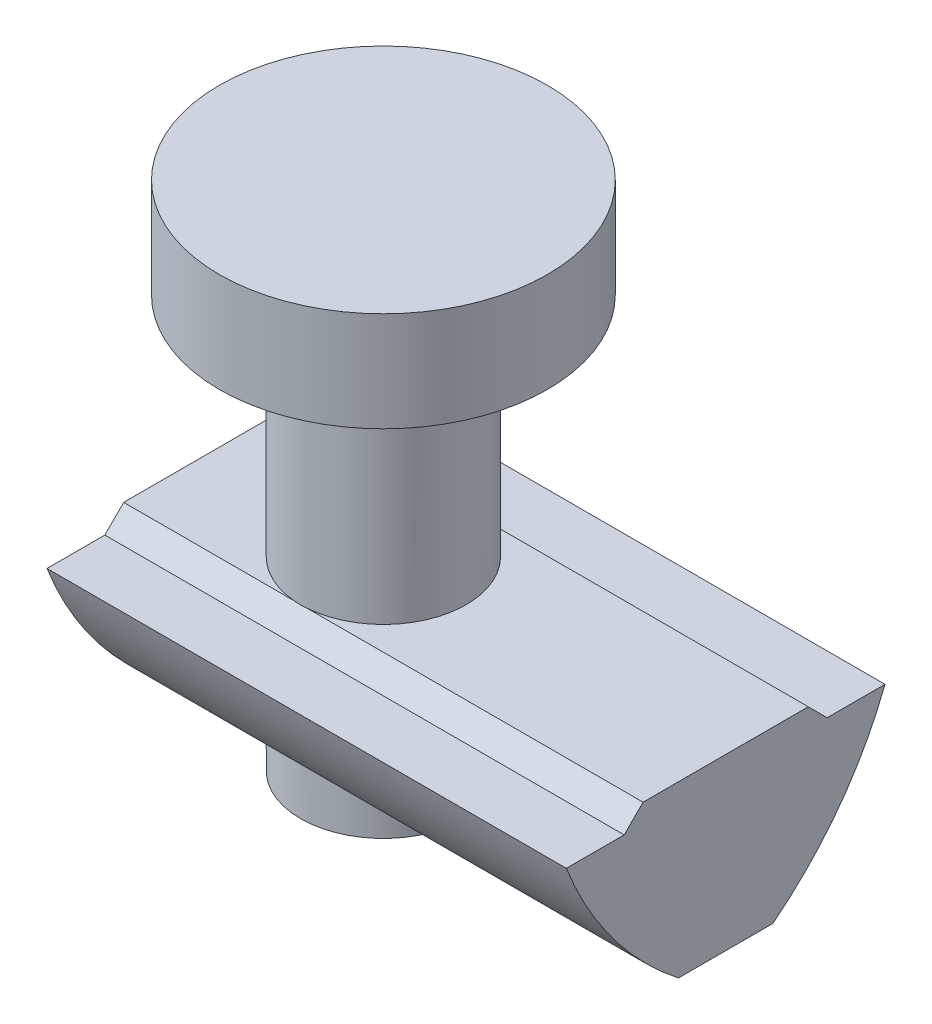
ISO-10303-21;
HEADER;
FILE_DESCRIPTION(('STEP AP214'),'2;1');
FILE_NAME('part.step','',(''),(''),'','','');
FILE_SCHEMA(('AUTOMOTIVE_DESIGN { 1 0 10303 214 1 1 1 1 }'));
ENDSEC;
DATA;
#1=APPLICATION_CONTEXT('core data for automotive mechanical design processes');
#2=APPLICATION_PROTOCOL_DEFINITION('international standard','automotive_design',2000,#1);
#3=PRODUCT_CONTEXT('',#1,'mechanical');
#4=PRODUCT('Part','Part','',(#3));
#5=PRODUCT_RELATED_PRODUCT_CATEGORY('part','',(#4));
#6=PRODUCT_DEFINITION_FORMATION('','',#4);
#7=PRODUCT_DEFINITION_CONTEXT('part definition',#1,'design');
#8=PRODUCT_DEFINITION('design','',#6,#7);
#9=PRODUCT_DEFINITION_SHAPE('','',#8);
#10=(LENGTH_UNIT() NAMED_UNIT(*) SI_UNIT(.MILLI.,.METRE.));
#11=(NAMED_UNIT(*) PLANE_ANGLE_UNIT() SI_UNIT($,.RADIAN.));
#12=(NAMED_UNIT(*) SI_UNIT($,.STERADIAN.) SOLID_ANGLE_UNIT());
#13=UNCERTAINTY_MEASURE_WITH_UNIT(LENGTH_MEASURE(1.E-05),#10,'distance_accuracy_value','');
#14=(GEOMETRIC_REPRESENTATION_CONTEXT(3) GLOBAL_UNCERTAINTY_ASSIGNED_CONTEXT((#13)) GLOBAL_UNIT_ASSIGNED_CONTEXT((#10,
#11,#12)) REPRESENTATION_CONTEXT('',''));
#15=CARTESIAN_POINT('',(0.,0.,0.));
#16=DIRECTION('',(0.,0.,1.));
#17=DIRECTION('',(1.,0.,0.));
#18=AXIS2_PLACEMENT_3D('',#15,#16,#17);
#19=CARTESIAN_POINT('',(0.,-17.46,0.));
#20=DIRECTION('',(0.,1.,0.));
#21=DIRECTION('',(0.,0.,1.));
#22=AXIS2_PLACEMENT_3D('',#19,#20,#21);
#23=CYLINDRICAL_SURFACE('',#22,3.51);
#24=CARTESIAN_POINT('',(0.,-9.60999999999999,0.));
#25=DIRECTION('',(0.,1.,0.));
#26=DIRECTION('',(0.,0.,1.));
#27=AXIS2_PLACEMENT_3D('',#24,#25,#26);
#28=CIRCLE('',#27,3.51);
#29=CARTESIAN_POINT('',(-0.264764045897468,-9.60999999999999,-3.5));
#30=VERTEX_POINT('',#29);
#31=CARTESIAN_POINT('',(-0.264764045897493,-9.60999999999999,3.5));
#32=VERTEX_POINT('',#31);
#33=EDGE_CURVE('E274',#30,#32,#28,.T.);
#34=ORIENTED_EDGE('',*,*,#33,.T.);
#35=CARTESIAN_POINT('',(0.,-6.10999999999996,0.));
#36=DIRECTION('',(0.,0.707106781186544,0.707106781186551));
#37=DIRECTION('',(0.,0.707106781186551,-0.707106781186544));
#38=AXIS2_PLACEMENT_3D('',#35,#36,#37);
#39=ELLIPSE('',#38,4.96388960392959,3.51);
#40=CARTESIAN_POINT('',(0.264764045897493,-9.60999999999999,3.5));
#41=VERTEX_POINT('',#40);
#42=EDGE_CURVE('E11',#32,#41,#39,.T.);
#43=ORIENTED_EDGE('',*,*,#42,.T.);
#44=CARTESIAN_POINT('',(0.264764045897468,-9.60999999999999,-3.5));
#45=VERTEX_POINT('',#44);
#46=EDGE_CURVE('E45',#41,#45,#28,.T.);
#47=ORIENTED_EDGE('',*,*,#46,.T.);
#48=CARTESIAN_POINT('',(0.,-6.10999999999995,0.));
#49=DIRECTION('',(0.,0.707106781186544,-0.707106781186551));
#50=DIRECTION('',(0.,0.707106781186551,0.707106781186544));
#51=AXIS2_PLACEMENT_3D('',#48,#49,#50);
#52=ELLIPSE('',#51,4.96388960392959,3.51);
#53=EDGE_CURVE('E422',#45,#30,#52,.T.);
#54=ORIENTED_EDGE('',*,*,#53,.T.);
#55=EDGE_LOOP('',(#34,#43,#47,#54));
#56=FACE_BOUND('',#55,.T.);
#57=CARTESIAN_POINT('',(0.,0.,0.));
#58=DIRECTION('',(0.,-1.,0.));
#59=DIRECTION('',(0.,0.,-1.));
#60=AXIS2_PLACEMENT_3D('',#57,#58,#59);
#61=CIRCLE('',#60,3.51);
#62=CARTESIAN_POINT('',(0.,0.,-3.51));
#63=VERTEX_POINT('',#62);
#64=EDGE_CURVE('E208',#63,#63,#61,.T.);
#65=ORIENTED_EDGE('',*,*,#64,.T.);
#66=EDGE_LOOP('',(#65));
#67=FACE_BOUND('',#66,.T.);
#68=ADVANCED_FACE('F37',(#56,#67),#23,.T.);
#69=CARTESIAN_POINT('',(0.,4.22,0.));
#70=DIRECTION('',(0.,-1.,0.));
#71=DIRECTION('',(0.,0.,-1.));
#72=AXIS2_PLACEMENT_3D('',#69,#70,#71);
#73=CYLINDRICAL_SURFACE('',#72,6.9469);
#74=CARTESIAN_POINT('',(0.,4.22,0.));
#75=DIRECTION('',(0.,1.,0.));
#76=DIRECTION('',(0.,0.,1.));
#77=AXIS2_PLACEMENT_3D('',#74,#75,#76);
#78=CIRCLE('',#77,6.9469);
#79=CARTESIAN_POINT('',(0.,4.22,6.9469));
#80=VERTEX_POINT('',#79);
#81=EDGE_CURVE('E212',#80,#80,#78,.T.);
#82=ORIENTED_EDGE('',*,*,#81,.F.);
#83=EDGE_LOOP('',(#82));
#84=FACE_BOUND('',#83,.T.);
#85=CARTESIAN_POINT('',(0.,0.,0.));
#86=DIRECTION('',(0.,1.,0.));
#87=DIRECTION('',(0.,0.,1.));
#88=AXIS2_PLACEMENT_3D('',#85,#86,#87);
#89=CIRCLE('',#88,6.9469);
#90=CARTESIAN_POINT('',(0.,0.,6.9469));
#91=VERTEX_POINT('',#90);
#92=EDGE_CURVE('E207',#91,#91,#89,.T.);
#93=ORIENTED_EDGE('',*,*,#92,.T.);
#94=EDGE_LOOP('',(#93));
#95=FACE_BOUND('',#94,.T.);
#96=ADVANCED_FACE('F39',(#84,#95),#73,.T.);
#97=CARTESIAN_POINT('',(0.,4.22,0.));
#98=DIRECTION('',(0.,1.,0.));
#99=DIRECTION('',(0.,0.,1.));
#100=AXIS2_PLACEMENT_3D('',#97,#98,#99);
#101=PLANE('',#100);
#102=ORIENTED_EDGE('',*,*,#81,.T.);
#103=EDGE_LOOP('',(#102));
#104=FACE_BOUND('',#103,.T.);
#105=ADVANCED_FACE('F269',(#104),#101,.T.);
#106=CARTESIAN_POINT('',(0.,0.,0.));
#107=DIRECTION('',(0.,1.,0.));
#108=DIRECTION('',(0.,0.,1.));
#109=AXIS2_PLACEMENT_3D('',#106,#107,#108);
#110=PLANE('',#109);
#111=ORIENTED_EDGE('',*,*,#64,.F.);
#112=EDGE_LOOP('',(#111));
#113=FACE_BOUND('',#112,.T.);
#114=ORIENTED_EDGE('',*,*,#92,.F.);
#115=EDGE_LOOP('',(#114));
#116=FACE_BOUND('',#115,.T.);
#117=ADVANCED_FACE('F253',(#113,#116),#110,.F.);
#118=CARTESIAN_POINT('',(-7.5,-4.99159388865923,-7.23716823422757));
#119=DIRECTION('',(1.,0.,0.));
#120=DIRECTION('',(0.,0.,-1.));
#121=AXIS2_PLACEMENT_3D('',#118,#119,#120);
#122=CYLINDRICAL_SURFACE('',#121,15.);
#123=CARTESIAN_POINT('',(3.33257802123772,-17.46,1.10182745126598));
#124=CARTESIAN_POINT('',(3.29310452584217,-17.3802181827396,1.22114941950491));
#125=CARTESIAN_POINT('',(3.24742601177364,-17.299652435643,1.33787249568093));
#126=CARTESIAN_POINT('',(3.14402916623642,-17.1378695044131,1.56552220170053));
#127=CARTESIAN_POINT('',(3.08630265363856,-17.0566519138698,1.67644482844273));
#128=CARTESIAN_POINT('',(2.95873179860326,-16.8939514112333,1.89258295619029));
#129=CARTESIAN_POINT('',(2.88879511663896,-16.8124714911222,1.99774630744985));
#130=CARTESIAN_POINT('',(2.73739234300323,-16.6511245128682,2.20063608104692));
#131=CARTESIAN_POINT('',(2.65593113221768,-16.5712567882054,2.29836562495572));
#132=CARTESIAN_POINT('',(2.43942354031206,-16.376581743037,2.53087828434168));
#133=CARTESIAN_POINT('',(2.29747963173018,-16.2634973735072,2.66080455045587));
#134=CARTESIAN_POINT('',(1.98864090448544,-16.0499362318492,2.8988331671463));
#135=CARTESIAN_POINT('',(1.82183080220155,-15.9494187048392,3.00700679581907));
#136=CARTESIAN_POINT('',(1.5100533302884,-15.7923364460791,3.17212737013558));
#137=CARTESIAN_POINT('',(1.37062321256283,-15.7311313516852,3.23508527871849));
#138=CARTESIAN_POINT('',(1.07929836663727,-15.6243021015928,3.3435380141433));
#139=CARTESIAN_POINT('',(0.927412898032283,-15.5786664991134,3.38904567357405));
#140=CARTESIAN_POINT('',(0.691972430545081,-15.525083511398,3.44207455077469));
#141=CARTESIAN_POINT('',(0.611752095403569,-15.5096570880741,3.45725347887993));
#142=CARTESIAN_POINT('',(0.449606790543756,-15.4843867370465,3.48204888737967));
#143=CARTESIAN_POINT('',(0.367682760599259,-15.4745398121001,3.49166835430874));
#144=CARTESIAN_POINT('',(0.202903086283217,-15.4607710101231,3.50510460148986));
#145=CARTESIAN_POINT('',(0.120047949496709,-15.4568460489529,3.50892440219601));
#146=CARTESIAN_POINT('',(-0.0457624518715196,-15.4550396465853,3.51068254276833));
#147=CARTESIAN_POINT('',(-0.12871770298907,-15.4571574673656,3.5086216008665));
#148=CARTESIAN_POINT('',(-0.3520182989428,-15.4709952782867,3.49513568088659));
#149=CARTESIAN_POINT('',(-0.49174429426034,-15.4884152935679,3.47814988800497));
#150=CARTESIAN_POINT('',(-0.765295069389144,-15.5389701030577,3.42838702445115));
#151=CARTESIAN_POINT('',(-0.899116792276374,-15.5721129357405,3.39560187603765));
#152=CARTESIAN_POINT('',(-1.19689860886472,-15.6631754734192,3.30430255685034));
#153=CARTESIAN_POINT('',(-1.35804369150114,-15.7255264480628,3.24104367939508));
#154=CARTESIAN_POINT('',(-1.6639110246039,-15.8659716872667,3.09521627696102));
#155=CARTESIAN_POINT('',(-1.80859852777229,-15.9440983290322,3.01260798347774));
#156=CARTESIAN_POINT('',(-2.12736810305838,-16.1393871769012,2.80045410650947));
#157=CARTESIAN_POINT('',(-2.29459645778018,-16.2607649689681,2.66451589142509));
#158=CARTESIAN_POINT('',(-2.59824849741671,-16.5133743703528,2.36941581688444));
#159=CARTESIAN_POINT('',(-2.73463046709667,-16.6446190075147,2.21022298185209));
#160=CARTESIAN_POINT('',(-2.95839840241687,-16.8910608455385,1.89718175890187));
#161=CARTESIAN_POINT('',(-3.05003912810439,-17.005782407271,1.74598506199662));
#162=CARTESIAN_POINT('',(-3.16959941880968,-17.1771858781604,1.51044569126368));
#163=CARTESIAN_POINT('',(-3.20640603739329,-17.2340789821329,1.43066590381632));
#164=CARTESIAN_POINT('',(-3.27402509484924,-17.3474362782946,1.26829914598668));
#165=CARTESIAN_POINT('',(-3.30483698880003,-17.4039004310443,1.18571192120867));
#166=CARTESIAN_POINT('',(-3.33257802123772,-17.46,1.10182745126598));
#167=B_SPLINE_CURVE_WITH_KNOTS('',3,(#123,#124,#125,#126,#127,#128,#129,#130,#131,#132,#133,
#134,#135,#136,#137,#138,#139,#140,#141,#142,#143,#144,#145,#146,#147,#148,#149,#150,#151,#152,
#153,#154,#155,#156,#157,#158,#159,#160,#161,#162,#163,#164,#165,#166),.UNSPECIFIED.,.F.,.F.,(4,
2,2,2,2,2,2,2,2,2,2,2,2,2,2,2,2,2,2,2,2,4),(0.,0.446416877470135,0.893137884005179,
1.34339641415629,1.79346481785386,2.46055869900195,3.12542971892121,3.61805043345066,
4.11030818593268,4.35924377250185,4.60804550663067,4.85671762083475,5.10535936529871,
5.52865913895802,5.95217556319948,6.50114808900782,7.05125896484999,7.7893766812487,
8.52848670388734,9.15899522292536,9.47282944973443,9.78669219081693),.UNSPECIFIED.);
#168=CARTESIAN_POINT('',(2.88445835470024,-16.81,2.));
#169=VERTEX_POINT('',#168);
#170=CARTESIAN_POINT('',(-2.88445835470024,-16.81,2.));
#171=VERTEX_POINT('',#170);
#172=EDGE_CURVE('E134',#169,#171,#167,.T.);
#173=ORIENTED_EDGE('',*,*,#172,.F.);
#174=DIRECTION('',(1.,0.,0.));
#175=VECTOR('',#174,1.);
#176=CARTESIAN_POINT('',(-7.5,-16.81,2.));
#177=LINE('',#176,#175);
#178=CARTESIAN_POINT('',(14.5,-16.81,2.));
#179=VERTEX_POINT('',#178);
#180=EDGE_CURVE('E126',#169,#179,#177,.T.);
#181=ORIENTED_EDGE('',*,*,#180,.T.);
#182=CARTESIAN_POINT('',(14.5,-4.99159388865923,-7.23716823422757));
#183=DIRECTION('',(1.,0.,0.));
#184=DIRECTION('',(0.,0.,-1.));
#185=AXIS2_PLACEMENT_3D('',#182,#183,#184);
#186=CIRCLE('',#185,15.);
#187=CARTESIAN_POINT('',(14.5,-10.41,6.75));
#188=VERTEX_POINT('',#187);
#189=EDGE_CURVE('E131',#188,#179,#186,.T.);
#190=ORIENTED_EDGE('',*,*,#189,.F.);
#191=DIRECTION('',(1.,0.,0.));
#192=VECTOR('',#191,1.);
#193=CARTESIAN_POINT('',(-7.5,-10.41,6.75));
#194=LINE('',#193,#192);
#195=CARTESIAN_POINT('',(-7.5,-10.41,6.75));
#196=VERTEX_POINT('',#195);
#197=EDGE_CURVE('E189',#196,#188,#194,.T.);
#198=ORIENTED_EDGE('',*,*,#197,.F.);
#199=CARTESIAN_POINT('',(-7.5,-4.99159388865923,-7.23716823422757));
#200=DIRECTION('',(1.,0.,0.));
#201=DIRECTION('',(0.,0.,-1.));
#202=AXIS2_PLACEMENT_3D('',#199,#200,#201);
#203=CIRCLE('',#202,15.);
#204=CARTESIAN_POINT('',(-7.5,-16.81,2.));
#205=VERTEX_POINT('',#204);
#206=EDGE_CURVE('E170',#196,#205,#203,.T.);
#207=ORIENTED_EDGE('',*,*,#206,.T.);
#208=EDGE_CURVE('E137',#205,#171,#177,.T.);
#209=ORIENTED_EDGE('',*,*,#208,.T.);
#210=EDGE_LOOP('',(#173,#181,#190,#198,#207,#209));
#211=FACE_BOUND('',#210,.T.);
#212=ADVANCED_FACE('F128',(#211),#122,.T.);
#213=CARTESIAN_POINT('',(-7.5,-9.60999999999999,3.5));
#214=DIRECTION('',(0.,1.,0.));
#215=DIRECTION('',(0.,0.,1.));
#216=AXIS2_PLACEMENT_3D('',#213,#214,#215);
#217=PLANE('',#216);
#218=ORIENTED_EDGE('',*,*,#46,.F.);
#219=DIRECTION('',(1.,0.,0.));
#220=VECTOR('',#219,1.);
#221=CARTESIAN_POINT('',(-7.5,-9.60999999999999,3.5));
#222=LINE('',#221,#220);
#223=CARTESIAN_POINT('',(14.5,-9.60999999999999,3.5));
#224=VERTEX_POINT('',#223);
#225=EDGE_CURVE('E197',#41,#224,#222,.T.);
#226=ORIENTED_EDGE('',*,*,#225,.T.);
#227=DIRECTION('',(0.,0.,1.));
#228=VECTOR('',#227,1.);
#229=CARTESIAN_POINT('',(14.5,-9.60999999999999,3.5));
#230=LINE('',#229,#228);
#231=CARTESIAN_POINT('',(14.5,-9.60999999999999,-3.5));
#232=VERTEX_POINT('',#231);
#233=EDGE_CURVE('E164',#232,#224,#230,.T.);
#234=ORIENTED_EDGE('',*,*,#233,.F.);
#235=DIRECTION('',(1.,0.,0.));
#236=VECTOR('',#235,1.);
#237=CARTESIAN_POINT('',(-7.5,-9.60999999999999,-3.5));
#238=LINE('',#237,#236);
#239=EDGE_CURVE('E199',#45,#232,#238,.T.);
#240=ORIENTED_EDGE('',*,*,#239,.F.);
#241=EDGE_LOOP('',(#218,#226,#234,#240));
#242=FACE_BOUND('',#241,.T.);
#243=ADVANCED_FACE('F244',(#242),#217,.T.);
#244=CARTESIAN_POINT('',(-7.5,-4.99159388865923,7.23716823422757));
#245=DIRECTION('',(1.,0.,0.));
#246=DIRECTION('',(0.,0.,-1.));
#247=AXIS2_PLACEMENT_3D('',#244,#245,#246);
#248=CYLINDRICAL_SURFACE('',#247,15.);
#249=CARTESIAN_POINT('',(-3.33257802123772,-17.46,-1.10182745126598));
#250=CARTESIAN_POINT('',(-3.29310452584217,-17.3802181827396,-1.22114941950491));
#251=CARTESIAN_POINT('',(-3.24742601177364,-17.299652435643,-1.33787249568093));
#252=CARTESIAN_POINT('',(-3.14402916623641,-17.1378695044131,-1.56552220170053));
#253=CARTESIAN_POINT('',(-3.08630265363855,-17.0566519138698,-1.67644482844273));
#254=CARTESIAN_POINT('',(-2.95873179860326,-16.8939514112333,-1.89258295619029));
#255=CARTESIAN_POINT('',(-2.88879511663896,-16.8124714911222,-1.99774630744986));
#256=CARTESIAN_POINT('',(-2.73739234300323,-16.6511245128682,-2.20063608104693));
#257=CARTESIAN_POINT('',(-2.65593113221767,-16.5712567882054,-2.29836562495572));
#258=CARTESIAN_POINT('',(-2.43942354031206,-16.376581743037,-2.53087828434168));
#259=CARTESIAN_POINT('',(-2.29747963173018,-16.2634973735072,-2.66080455045588));
#260=CARTESIAN_POINT('',(-1.98864090448544,-16.0499362318492,-2.89883316714631));
#261=CARTESIAN_POINT('',(-1.82183080220154,-15.9494187048392,-3.00700679581907));
#262=CARTESIAN_POINT('',(-1.5100533302884,-15.7923364460791,-3.17212737013558));
#263=CARTESIAN_POINT('',(-1.37062321256283,-15.7311313516852,-3.23508527871849));
#264=CARTESIAN_POINT('',(-1.07929836663727,-15.6243021015928,-3.3435380141433));
#265=CARTESIAN_POINT('',(-0.927412898032282,-15.5786664991134,-3.38904567357405));
#266=CARTESIAN_POINT('',(-0.69197243054508,-15.525083511398,-3.44207455077469));
#267=CARTESIAN_POINT('',(-0.611752095403568,-15.5096570880741,-3.45725347887993));
#268=CARTESIAN_POINT('',(-0.449606790543756,-15.4843867370465,-3.48204888737967));
#269=CARTESIAN_POINT('',(-0.367682760599259,-15.4745398121001,-3.49166835430874));
#270=CARTESIAN_POINT('',(-0.202903086283217,-15.4607710101231,-3.50510460148986));
#271=CARTESIAN_POINT('',(-0.120047949496709,-15.4568460489529,-3.50892440219601));
#272=CARTESIAN_POINT('',(0.0457624518715192,-15.4550396465853,-3.51068254276833));
#273=CARTESIAN_POINT('',(0.12871770298907,-15.4571574673656,-3.5086216008665));
#274=CARTESIAN_POINT('',(0.3520182989428,-15.4709952782867,-3.49513568088658));
#275=CARTESIAN_POINT('',(0.49174429426034,-15.4884152935679,-3.47814988800496));
#276=CARTESIAN_POINT('',(0.765295069389145,-15.5389701030577,-3.42838702445115));
#277=CARTESIAN_POINT('',(0.899116792276374,-15.5721129357405,-3.39560187603765));
#278=CARTESIAN_POINT('',(1.19689860886472,-15.6631754734192,-3.30430255685034));
#279=CARTESIAN_POINT('',(1.35804369150114,-15.7255264480628,-3.24104367939508));
#280=CARTESIAN_POINT('',(1.6639110246039,-15.8659716872667,-3.09521627696102));
#281=CARTESIAN_POINT('',(1.80859852777229,-15.9440983290322,-3.01260798347774));
#282=CARTESIAN_POINT('',(2.12736810305838,-16.1393871769012,-2.80045410650947));
#283=CARTESIAN_POINT('',(2.29459645778018,-16.2607649689681,-2.66451589142509));
#284=CARTESIAN_POINT('',(2.59824849741671,-16.5133743703528,-2.36941581688444));
#285=CARTESIAN_POINT('',(2.73463046709667,-16.6446190075147,-2.21022298185209));
#286=CARTESIAN_POINT('',(2.95839840241687,-16.8910608455385,-1.89718175890187));
#287=CARTESIAN_POINT('',(3.05003912810439,-17.005782407271,-1.74598506199662));
#288=CARTESIAN_POINT('',(3.16959941880968,-17.1771858781604,-1.51044569126369));
#289=CARTESIAN_POINT('',(3.20640603739329,-17.2340789821329,-1.43066590381632));
#290=CARTESIAN_POINT('',(3.27402509484924,-17.3474362782946,-1.26829914598669));
#291=CARTESIAN_POINT('',(3.30483698880003,-17.4039004310443,-1.18571192120867));
#292=CARTESIAN_POINT('',(3.33257802123772,-17.46,-1.10182745126598));
#293=B_SPLINE_CURVE_WITH_KNOTS('',3,(#249,#250,#251,#252,#253,#254,#255,#256,#257,#258,#259,
#260,#261,#262,#263,#264,#265,#266,#267,#268,#269,#270,#271,#272,#273,#274,#275,#276,#277,#278,
#279,#280,#281,#282,#283,#284,#285,#286,#287,#288,#289,#290,#291,#292),.UNSPECIFIED.,.F.,.F.,(4,
2,2,2,2,2,2,2,2,2,2,2,2,2,2,2,2,2,2,2,2,4),(0.,0.446416877470138,0.893137884005183,
1.34339641415629,1.79346481785386,2.46055869900195,3.12542971892121,3.61805043345066,
4.11030818593267,4.35924377250185,4.60804550663067,4.85671762083475,5.10535936529871,
5.52865913895802,5.95217556319948,6.50114808900782,7.05125896484999,7.7893766812487,
8.52848670388734,9.15899522292536,9.47282944973442,9.78669219081692),.UNSPECIFIED.);
#294=CARTESIAN_POINT('',(-2.88445835470024,-16.81,-2.));
#295=VERTEX_POINT('',#294);
#296=CARTESIAN_POINT('',(2.88445835470024,-16.81,-2.));
#297=VERTEX_POINT('',#296);
#298=EDGE_CURVE('E219',#295,#297,#293,.T.);
#299=ORIENTED_EDGE('',*,*,#298,.F.);
#300=DIRECTION('',(1.,0.,0.));
#301=VECTOR('',#300,1.);
#302=CARTESIAN_POINT('',(-7.5,-16.81,-2.));
#303=LINE('',#302,#301);
#304=CARTESIAN_POINT('',(-7.5,-16.81,-2.));
#305=VERTEX_POINT('',#304);
#306=EDGE_CURVE('E60',#305,#295,#303,.T.);
#307=ORIENTED_EDGE('',*,*,#306,.F.);
#308=CARTESIAN_POINT('',(-7.5,-4.99159388865923,7.23716823422757));
#309=DIRECTION('',(1.,0.,0.));
#310=DIRECTION('',(0.,0.,1.));
#311=AXIS2_PLACEMENT_3D('',#308,#309,#310);
#312=CIRCLE('',#311,15.);
#313=CARTESIAN_POINT('',(-7.5,-10.41,-6.75));
#314=VERTEX_POINT('',#313);
#315=EDGE_CURVE('E175',#305,#314,#312,.T.);
#316=ORIENTED_EDGE('',*,*,#315,.T.);
#317=DIRECTION('',(1.,0.,0.));
#318=VECTOR('',#317,1.);
#319=CARTESIAN_POINT('',(-7.5,-10.41,-6.75));
#320=LINE('',#319,#318);
#321=CARTESIAN_POINT('',(14.5,-10.41,-6.75));
#322=VERTEX_POINT('',#321);
#323=EDGE_CURVE('E202',#314,#322,#320,.T.);
#324=ORIENTED_EDGE('',*,*,#323,.T.);
#325=CARTESIAN_POINT('',(14.5,-4.99159388865923,7.23716823422757));
#326=DIRECTION('',(1.,0.,0.));
#327=DIRECTION('',(0.,0.,1.));
#328=AXIS2_PLACEMENT_3D('',#325,#326,#327);
#329=CIRCLE('',#328,15.);
#330=CARTESIAN_POINT('',(14.5,-16.81,-2.));
#331=VERTEX_POINT('',#330);
#332=EDGE_CURVE('E148',#331,#322,#329,.T.);
#333=ORIENTED_EDGE('',*,*,#332,.F.);
#334=EDGE_CURVE('E144',#297,#331,#303,.T.);
#335=ORIENTED_EDGE('',*,*,#334,.F.);
#336=EDGE_LOOP('',(#299,#307,#316,#324,#333,#335));
#337=FACE_BOUND('',#336,.T.);
#338=ADVANCED_FACE('F239',(#337),#248,.T.);
#339=CARTESIAN_POINT('',(-7.5,-16.81,2.));
#340=DIRECTION('',(0.,-1.,0.));
#341=DIRECTION('',(0.,0.,-1.));
#342=AXIS2_PLACEMENT_3D('',#339,#340,#341);
#343=PLANE('',#342);
#344=CARTESIAN_POINT('',(0.,-16.81,0.));
#345=DIRECTION('',(0.,-1.,0.));
#346=DIRECTION('',(0.,0.,-1.));
#347=AXIS2_PLACEMENT_3D('',#344,#345,#346);
#348=CIRCLE('',#347,3.51);
#349=EDGE_CURVE('E220',#297,#169,#348,.T.);
#350=ORIENTED_EDGE('',*,*,#349,.F.);
#351=ORIENTED_EDGE('',*,*,#334,.T.);
#352=DIRECTION('',(0.,0.,-1.));
#353=VECTOR('',#352,1.);
#354=CARTESIAN_POINT('',(14.5,-16.81,2.));
#355=LINE('',#354,#353);
#356=EDGE_CURVE('E141',#179,#331,#355,.T.);
#357=ORIENTED_EDGE('',*,*,#356,.F.);
#358=ORIENTED_EDGE('',*,*,#180,.F.);
#359=EDGE_LOOP('',(#350,#351,#357,#358));
#360=FACE_BOUND('',#359,.T.);
#361=ADVANCED_FACE('F142',(#360),#343,.T.);
#362=CARTESIAN_POINT('',(-7.5,-10.41,6.249999984));
#363=DIRECTION('',(0.,1.,0.));
#364=DIRECTION('',(0.,0.,1.));
#365=AXIS2_PLACEMENT_3D('',#362,#363,#364);
#366=PLANE('',#365);
#367=ORIENTED_EDGE('',*,*,#197,.T.);
#368=DIRECTION('',(0.,0.,1.));
#369=VECTOR('',#368,1.);
#370=CARTESIAN_POINT('',(14.5,-10.41,6.249999984));
#371=LINE('',#370,#369);
#372=CARTESIAN_POINT('',(14.5,-10.41,4.3));
#373=VERTEX_POINT('',#372);
#374=EDGE_CURVE('E154',#373,#188,#371,.T.);
#375=ORIENTED_EDGE('',*,*,#374,.F.);
#376=DIRECTION('',(1.,0.,0.));
#377=VECTOR('',#376,1.);
#378=CARTESIAN_POINT('',(-7.5,-10.41,4.3));
#379=LINE('',#378,#377);
#380=CARTESIAN_POINT('',(-7.5,-10.41,4.3));
#381=VERTEX_POINT('',#380);
#382=EDGE_CURVE('E192',#381,#373,#379,.T.);
#383=ORIENTED_EDGE('',*,*,#382,.F.);
#384=DIRECTION('',(0.,0.,1.));
#385=VECTOR('',#384,1.);
#386=CARTESIAN_POINT('',(-7.5,-10.41,6.249999984));
#387=LINE('',#386,#385);
#388=EDGE_CURVE('E138',#381,#196,#387,.T.);
#389=ORIENTED_EDGE('',*,*,#388,.T.);
#390=EDGE_LOOP('',(#367,#375,#383,#389));
#391=FACE_BOUND('',#390,.T.);
#392=ADVANCED_FACE('F337',(#391),#366,.T.);
#393=CARTESIAN_POINT('',(-7.5,-9.60999999999999,3.5));
#394=DIRECTION('',(0.,0.707106781186544,0.707106781186551));
#395=DIRECTION('',(0.,-0.707106781186551,0.707106781186544));
#396=AXIS2_PLACEMENT_3D('',#393,#394,#395);
#397=PLANE('',#396);
#398=ORIENTED_EDGE('',*,*,#42,.F.);
#399=CARTESIAN_POINT('',(-7.5,-9.60999999999999,3.5));
#400=VERTEX_POINT('',#399);
#401=EDGE_CURVE('E194',#400,#32,#222,.T.);
#402=ORIENTED_EDGE('',*,*,#401,.F.);
#403=DIRECTION('',(0.,-0.707106781186551,0.707106781186544));
#404=VECTOR('',#403,1.);
#405=CARTESIAN_POINT('',(-7.5,-9.60999999999999,3.5));
#406=LINE('',#405,#404);
#407=EDGE_CURVE('E185',#400,#381,#406,.T.);
#408=ORIENTED_EDGE('',*,*,#407,.T.);
#409=ORIENTED_EDGE('',*,*,#382,.T.);
#410=DIRECTION('',(0.,-0.707106781186551,0.707106781186544));
#411=VECTOR('',#410,1.);
#412=CARTESIAN_POINT('',(14.5,-9.60999999999999,3.5));
#413=LINE('',#412,#411);
#414=EDGE_CURVE('E167',#224,#373,#413,.T.);
#415=ORIENTED_EDGE('',*,*,#414,.F.);
#416=ORIENTED_EDGE('',*,*,#225,.F.);
#417=EDGE_LOOP('',(#398,#402,#408,#409,#415,#416));
#418=FACE_BOUND('',#417,.T.);
#419=ADVANCED_FACE('F344',(#418),#397,.T.);
#420=ORIENTED_EDGE('',*,*,#33,.F.);
#421=CARTESIAN_POINT('',(-7.5,-9.60999999999999,-3.5));
#422=VERTEX_POINT('',#421);
#423=EDGE_CURVE('E52',#422,#30,#238,.T.);
#424=ORIENTED_EDGE('',*,*,#423,.F.);
#425=DIRECTION('',(0.,0.,1.));
#426=VECTOR('',#425,1.);
#427=CARTESIAN_POINT('',(-7.5,-9.60999999999999,3.5));
#428=LINE('',#427,#426);
#429=EDGE_CURVE('E182',#422,#400,#428,.T.);
#430=ORIENTED_EDGE('',*,*,#429,.T.);
#431=ORIENTED_EDGE('',*,*,#401,.T.);
#432=EDGE_LOOP('',(#420,#424,#430,#431));
#433=FACE_BOUND('',#432,.T.);
#434=ADVANCED_FACE('F325',(#433),#217,.T.);
#435=CARTESIAN_POINT('',(-7.5,-9.60999999999999,-3.5));
#436=DIRECTION('',(0.,0.707106781186544,-0.707106781186551));
#437=DIRECTION('',(0.,0.707106781186551,0.707106781186544));
#438=AXIS2_PLACEMENT_3D('',#435,#436,#437);
#439=PLANE('',#438);
#440=ORIENTED_EDGE('',*,*,#53,.F.);
#441=ORIENTED_EDGE('',*,*,#239,.T.);
#442=DIRECTION('',(0.,0.707106781186551,0.707106781186544));
#443=VECTOR('',#442,1.);
#444=CARTESIAN_POINT('',(14.5,-9.60999999999999,-3.5));
#445=LINE('',#444,#443);
#446=CARTESIAN_POINT('',(14.5,-10.41,-4.3));
#447=VERTEX_POINT('',#446);
#448=EDGE_CURVE('E161',#447,#232,#445,.T.);
#449=ORIENTED_EDGE('',*,*,#448,.F.);
#450=DIRECTION('',(1.,0.,0.));
#451=VECTOR('',#450,1.);
#452=CARTESIAN_POINT('',(-7.5,-10.41,-4.3));
#453=LINE('',#452,#451);
#454=CARTESIAN_POINT('',(-7.5,-10.41,-4.3));
#455=VERTEX_POINT('',#454);
#456=EDGE_CURVE('E200',#455,#447,#453,.T.);
#457=ORIENTED_EDGE('',*,*,#456,.F.);
#458=DIRECTION('',(0.,0.707106781186551,0.707106781186544));
#459=VECTOR('',#458,1.);
#460=CARTESIAN_POINT('',(-7.5,-9.60999999999999,-3.5));
#461=LINE('',#460,#459);
#462=EDGE_CURVE('E180',#455,#422,#461,.T.);
#463=ORIENTED_EDGE('',*,*,#462,.T.);
#464=ORIENTED_EDGE('',*,*,#423,.T.);
#465=EDGE_LOOP('',(#440,#441,#449,#457,#463,#464));
#466=FACE_BOUND('',#465,.T.);
#467=ADVANCED_FACE('F364',(#466),#439,.T.);
#468=CARTESIAN_POINT('',(-7.5,-10.41,-6.249999984));
#469=DIRECTION('',(0.,1.,0.));
#470=DIRECTION('',(0.,0.,1.));
#471=AXIS2_PLACEMENT_3D('',#468,#469,#470);
#472=PLANE('',#471);
#473=ORIENTED_EDGE('',*,*,#456,.T.);
#474=DIRECTION('',(0.,0.,1.));
#475=VECTOR('',#474,1.);
#476=CARTESIAN_POINT('',(14.5,-10.41,-6.249999984));
#477=LINE('',#476,#475);
#478=EDGE_CURVE('E158',#322,#447,#477,.T.);
#479=ORIENTED_EDGE('',*,*,#478,.F.);
#480=ORIENTED_EDGE('',*,*,#323,.F.);
#481=DIRECTION('',(0.,0.,1.));
#482=VECTOR('',#481,1.);
#483=CARTESIAN_POINT('',(-7.5,-10.41,-6.249999984));
#484=LINE('',#483,#482);
#485=EDGE_CURVE('E178',#314,#455,#484,.T.);
#486=ORIENTED_EDGE('',*,*,#485,.T.);
#487=EDGE_LOOP('',(#473,#479,#480,#486));
#488=FACE_BOUND('',#487,.T.);
#489=ADVANCED_FACE('F246',(#488),#472,.T.);
#490=EDGE_CURVE('E211',#171,#295,#348,.T.);
#491=ORIENTED_EDGE('',*,*,#490,.F.);
#492=ORIENTED_EDGE('',*,*,#208,.F.);
#493=DIRECTION('',(0.,0.,-1.));
#494=VECTOR('',#493,1.);
#495=CARTESIAN_POINT('',(-7.5,-16.81,2.));
#496=LINE('',#495,#494);
#497=EDGE_CURVE('E173',#205,#305,#496,.T.);
#498=ORIENTED_EDGE('',*,*,#497,.T.);
#499=ORIENTED_EDGE('',*,*,#306,.T.);
#500=EDGE_LOOP('',(#491,#492,#498,#499));
#501=FACE_BOUND('',#500,.T.);
#502=ADVANCED_FACE('F248',(#501),#343,.T.);
#503=CARTESIAN_POINT('',(-7.5,-4.99159388865923,-7.23716823422757));
#504=DIRECTION('',(1.,0.,0.));
#505=DIRECTION('',(0.,0.,-1.));
#506=AXIS2_PLACEMENT_3D('',#503,#504,#505);
#507=PLANE('',#506);
#508=ORIENTED_EDGE('',*,*,#206,.F.);
#509=ORIENTED_EDGE('',*,*,#388,.F.);
#510=ORIENTED_EDGE('',*,*,#407,.F.);
#511=ORIENTED_EDGE('',*,*,#429,.F.);
#512=ORIENTED_EDGE('',*,*,#462,.F.);
#513=ORIENTED_EDGE('',*,*,#485,.F.);
#514=ORIENTED_EDGE('',*,*,#315,.F.);
#515=ORIENTED_EDGE('',*,*,#497,.F.);
#516=EDGE_LOOP('',(#508,#509,#510,#511,#512,#513,#514,#515));
#517=FACE_BOUND('',#516,.T.);
#518=ADVANCED_FACE('F250',(#517),#507,.F.);
#519=CARTESIAN_POINT('',(14.5,-4.99159388865923,-7.23716823422757));
#520=DIRECTION('',(1.,0.,0.));
#521=DIRECTION('',(0.,0.,-1.));
#522=AXIS2_PLACEMENT_3D('',#519,#520,#521);
#523=PLANE('',#522);
#524=ORIENTED_EDGE('',*,*,#189,.T.);
#525=ORIENTED_EDGE('',*,*,#356,.T.);
#526=ORIENTED_EDGE('',*,*,#332,.T.);
#527=ORIENTED_EDGE('',*,*,#478,.T.);
#528=ORIENTED_EDGE('',*,*,#448,.T.);
#529=ORIENTED_EDGE('',*,*,#233,.T.);
#530=ORIENTED_EDGE('',*,*,#414,.T.);
#531=ORIENTED_EDGE('',*,*,#374,.T.);
#532=EDGE_LOOP('',(#524,#525,#526,#527,#528,#529,#530,#531));
#533=FACE_BOUND('',#532,.T.);
#534=ADVANCED_FACE('F151',(#533),#523,.T.);
#535=CARTESIAN_POINT('',(0.,-17.46,0.));
#536=DIRECTION('',(0.,-1.,0.));
#537=DIRECTION('',(0.,0.,-1.));
#538=AXIS2_PLACEMENT_3D('',#535,#536,#537);
#539=PLANE('',#538);
#540=CARTESIAN_POINT('',(0.,-17.46,0.));
#541=DIRECTION('',(0.,-1.,0.));
#542=DIRECTION('',(0.,0.,-1.));
#543=AXIS2_PLACEMENT_3D('',#540,#541,#542);
#544=CIRCLE('',#543,3.51);
#545=CARTESIAN_POINT('',(0.,-17.46,-3.51));
#546=VERTEX_POINT('',#545);
#547=EDGE_CURVE('E191',#546,#546,#544,.T.);
#548=ORIENTED_EDGE('',*,*,#547,.T.);
#549=EDGE_LOOP('',(#548));
#550=FACE_BOUND('',#549,.T.);
#551=ADVANCED_FACE('F254',(#550),#539,.T.);
#552=ORIENTED_EDGE('',*,*,#298,.T.);
#553=ORIENTED_EDGE('',*,*,#349,.T.);
#554=ORIENTED_EDGE('',*,*,#172,.T.);
#555=ORIENTED_EDGE('',*,*,#490,.T.);
#556=EDGE_LOOP('',(#552,#553,#554,#555));
#557=FACE_BOUND('',#556,.T.);
#558=ORIENTED_EDGE('',*,*,#547,.F.);
#559=EDGE_LOOP('',(#558));
#560=FACE_BOUND('',#559,.T.);
#561=ADVANCED_FACE('F235',(#557,#560),#23,.T.);
#562=CLOSED_SHELL('',(#68,#96,#105,#117,#212,#243,#338,#361,#392,#419,#434,#467,#489,#502,#518,
#534,#551,#561));
#563=MANIFOLD_SOLID_BREP('B2',#562);
#564=ADVANCED_BREP_SHAPE_REPRESENTATION('',(#18,#563),#14);
#565=SHAPE_DEFINITION_REPRESENTATION(#9,#564);
ENDSEC;
END-ISO-10303-21;
